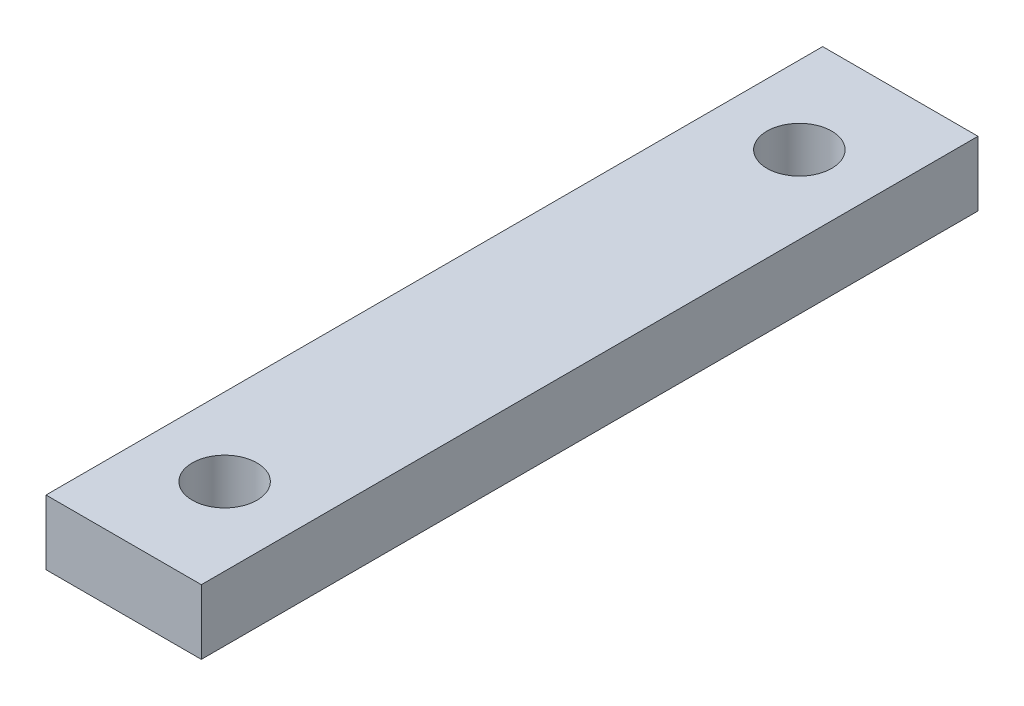
ISO-10303-21;
HEADER;
FILE_DESCRIPTION(('STEP AP214'),'2;1');
FILE_NAME('part.step','',(''),(''),'','','');
FILE_SCHEMA(('AUTOMOTIVE_DESIGN { 1 0 10303 214 1 1 1 1 }'));
ENDSEC;
DATA;
#1=APPLICATION_CONTEXT('core data for automotive mechanical design processes');
#2=APPLICATION_PROTOCOL_DEFINITION('international standard','automotive_design',2000,#1);
#3=PRODUCT_CONTEXT('',#1,'mechanical');
#4=PRODUCT('Part','Part','',(#3));
#5=PRODUCT_RELATED_PRODUCT_CATEGORY('part','',(#4));
#6=PRODUCT_DEFINITION_FORMATION('','',#4);
#7=PRODUCT_DEFINITION_CONTEXT('part definition',#1,'design');
#8=PRODUCT_DEFINITION('design','',#6,#7);
#9=PRODUCT_DEFINITION_SHAPE('','',#8);
#10=(LENGTH_UNIT() NAMED_UNIT(*) SI_UNIT(.MILLI.,.METRE.));
#11=(NAMED_UNIT(*) PLANE_ANGLE_UNIT() SI_UNIT($,.RADIAN.));
#12=(NAMED_UNIT(*) SI_UNIT($,.STERADIAN.) SOLID_ANGLE_UNIT());
#13=UNCERTAINTY_MEASURE_WITH_UNIT(LENGTH_MEASURE(1.E-05),#10,'distance_accuracy_value','');
#14=(GEOMETRIC_REPRESENTATION_CONTEXT(3) GLOBAL_UNCERTAINTY_ASSIGNED_CONTEXT((#13)) GLOBAL_UNIT_ASSIGNED_CONTEXT((#10,
#11,#12)) REPRESENTATION_CONTEXT('',''));
#15=CARTESIAN_POINT('',(0.,0.,0.));
#16=DIRECTION('',(0.,0.,1.));
#17=DIRECTION('',(1.,0.,0.));
#18=AXIS2_PLACEMENT_3D('',#15,#16,#17);
#19=CARTESIAN_POINT('',(30.,25.,150.));
#20=DIRECTION('',(-1.,0.,0.));
#21=DIRECTION('',(0.,0.,1.));
#22=AXIS2_PLACEMENT_3D('',#19,#20,#21);
#23=PLANE('',#22);
#24=DIRECTION('',(0.,0.,-1.));
#25=VECTOR('',#24,1.);
#26=CARTESIAN_POINT('',(30.,0.,150.));
#27=LINE('',#26,#25);
#28=CARTESIAN_POINT('',(30.,0.,150.));
#29=VERTEX_POINT('',#28);
#30=CARTESIAN_POINT('',(30.,0.,-150.));
#31=VERTEX_POINT('',#30);
#32=EDGE_CURVE('E80',#29,#31,#27,.T.);
#33=ORIENTED_EDGE('',*,*,#32,.T.);
#34=DIRECTION('',(0.,-1.,0.));
#35=VECTOR('',#34,1.);
#36=CARTESIAN_POINT('',(30.,25.,-150.));
#37=LINE('',#36,#35);
#38=CARTESIAN_POINT('',(30.,25.,-150.));
#39=VERTEX_POINT('',#38);
#40=EDGE_CURVE('E11',#39,#31,#37,.T.);
#41=ORIENTED_EDGE('',*,*,#40,.F.);
#42=DIRECTION('',(0.,0.,-1.));
#43=VECTOR('',#42,1.);
#44=CARTESIAN_POINT('',(30.,25.,150.));
#45=LINE('',#44,#43);
#46=CARTESIAN_POINT('',(30.,25.,150.));
#47=VERTEX_POINT('',#46);
#48=EDGE_CURVE('E68',#47,#39,#45,.T.);
#49=ORIENTED_EDGE('',*,*,#48,.F.);
#50=DIRECTION('',(0.,-1.,0.));
#51=VECTOR('',#50,1.);
#52=CARTESIAN_POINT('',(30.,25.,150.));
#53=LINE('',#52,#51);
#54=EDGE_CURVE('E76',#47,#29,#53,.T.);
#55=ORIENTED_EDGE('',*,*,#54,.T.);
#56=EDGE_LOOP('',(#33,#41,#49,#55));
#57=FACE_BOUND('',#56,.T.);
#58=ADVANCED_FACE('F17',(#57),#23,.F.);
#59=CARTESIAN_POINT('',(-30.,25.,-150.));
#60=DIRECTION('',(0.,0.,1.));
#61=DIRECTION('',(1.,0.,0.));
#62=AXIS2_PLACEMENT_3D('',#59,#60,#61);
#63=PLANE('',#62);
#64=DIRECTION('',(-1.,0.,0.));
#65=VECTOR('',#64,1.);
#66=CARTESIAN_POINT('',(-30.,0.,-150.));
#67=LINE('',#66,#65);
#68=CARTESIAN_POINT('',(-30.,0.,-150.));
#69=VERTEX_POINT('',#68);
#70=EDGE_CURVE('E72',#31,#69,#67,.T.);
#71=ORIENTED_EDGE('',*,*,#70,.T.);
#72=DIRECTION('',(0.,-1.,0.));
#73=VECTOR('',#72,1.);
#74=CARTESIAN_POINT('',(-30.,25.,-150.));
#75=LINE('',#74,#73);
#76=CARTESIAN_POINT('',(-30.,25.,-150.));
#77=VERTEX_POINT('',#76);
#78=EDGE_CURVE('E25',#77,#69,#75,.T.);
#79=ORIENTED_EDGE('',*,*,#78,.F.);
#80=DIRECTION('',(-1.,0.,0.));
#81=VECTOR('',#80,1.);
#82=CARTESIAN_POINT('',(-30.,25.,-150.));
#83=LINE('',#82,#81);
#84=EDGE_CURVE('E63',#39,#77,#83,.T.);
#85=ORIENTED_EDGE('',*,*,#84,.F.);
#86=ORIENTED_EDGE('',*,*,#40,.T.);
#87=EDGE_LOOP('',(#71,#79,#85,#86));
#88=FACE_BOUND('',#87,.T.);
#89=ADVANCED_FACE('F71',(#88),#63,.F.);
#90=CARTESIAN_POINT('',(-30.,25.,150.));
#91=DIRECTION('',(1.,0.,0.));
#92=DIRECTION('',(0.,0.,-1.));
#93=AXIS2_PLACEMENT_3D('',#90,#91,#92);
#94=PLANE('',#93);
#95=DIRECTION('',(0.,0.,1.));
#96=VECTOR('',#95,1.);
#97=CARTESIAN_POINT('',(-30.,0.,150.));
#98=LINE('',#97,#96);
#99=CARTESIAN_POINT('',(-30.,0.,150.));
#100=VERTEX_POINT('',#99);
#101=EDGE_CURVE('E50',#69,#100,#98,.T.);
#102=ORIENTED_EDGE('',*,*,#101,.T.);
#103=DIRECTION('',(0.,-1.,0.));
#104=VECTOR('',#103,1.);
#105=CARTESIAN_POINT('',(-30.,25.,150.));
#106=LINE('',#105,#104);
#107=CARTESIAN_POINT('',(-30.,25.,150.));
#108=VERTEX_POINT('',#107);
#109=EDGE_CURVE('E73',#108,#100,#106,.T.);
#110=ORIENTED_EDGE('',*,*,#109,.F.);
#111=DIRECTION('',(0.,0.,1.));
#112=VECTOR('',#111,1.);
#113=CARTESIAN_POINT('',(-30.,25.,150.));
#114=LINE('',#113,#112);
#115=EDGE_CURVE('E66',#77,#108,#114,.T.);
#116=ORIENTED_EDGE('',*,*,#115,.F.);
#117=ORIENTED_EDGE('',*,*,#78,.T.);
#118=EDGE_LOOP('',(#102,#110,#116,#117));
#119=FACE_BOUND('',#118,.T.);
#120=ADVANCED_FACE('F74',(#119),#94,.F.);
#121=CARTESIAN_POINT('',(-30.,25.,150.));
#122=DIRECTION('',(0.,0.,-1.));
#123=DIRECTION('',(-1.,0.,0.));
#124=AXIS2_PLACEMENT_3D('',#121,#122,#123);
#125=PLANE('',#124);
#126=DIRECTION('',(1.,0.,0.));
#127=VECTOR('',#126,1.);
#128=CARTESIAN_POINT('',(-30.,0.,150.));
#129=LINE('',#128,#127);
#130=EDGE_CURVE('E56',#100,#29,#129,.T.);
#131=ORIENTED_EDGE('',*,*,#130,.T.);
#132=ORIENTED_EDGE('',*,*,#54,.F.);
#133=DIRECTION('',(1.,0.,0.));
#134=VECTOR('',#133,1.);
#135=CARTESIAN_POINT('',(-30.,25.,150.));
#136=LINE('',#135,#134);
#137=EDGE_CURVE('E33',#108,#47,#136,.T.);
#138=ORIENTED_EDGE('',*,*,#137,.F.);
#139=ORIENTED_EDGE('',*,*,#109,.T.);
#140=EDGE_LOOP('',(#131,#132,#138,#139));
#141=FACE_BOUND('',#140,.T.);
#142=ADVANCED_FACE('F88',(#141),#125,.F.);
#143=CARTESIAN_POINT('',(0.,25.,0.));
#144=DIRECTION('',(0.,-1.,0.));
#145=DIRECTION('',(0.,0.,-1.));
#146=AXIS2_PLACEMENT_3D('',#143,#144,#145);
#147=PLANE('',#146);
#148=CARTESIAN_POINT('',(0.,25.,111.));
#149=DIRECTION('',(0.,1.,0.));
#150=DIRECTION('',(0.,0.,1.));
#151=AXIS2_PLACEMENT_3D('',#148,#149,#150);
#152=CIRCLE('',#151,12.5);
#153=CARTESIAN_POINT('',(0.,25.,123.5));
#154=VERTEX_POINT('',#153);
#155=EDGE_CURVE('E100',#154,#154,#152,.T.);
#156=ORIENTED_EDGE('',*,*,#155,.F.);
#157=EDGE_LOOP('',(#156));
#158=FACE_BOUND('',#157,.T.);
#159=CARTESIAN_POINT('',(0.,25.,-111.));
#160=DIRECTION('',(0.,1.,0.));
#161=DIRECTION('',(0.,0.,1.));
#162=AXIS2_PLACEMENT_3D('',#159,#160,#161);
#163=CIRCLE('',#162,12.5);
#164=CARTESIAN_POINT('',(0.,25.,-98.5));
#165=VERTEX_POINT('',#164);
#166=EDGE_CURVE('E94',#165,#165,#163,.T.);
#167=ORIENTED_EDGE('',*,*,#166,.F.);
#168=EDGE_LOOP('',(#167));
#169=FACE_BOUND('',#168,.T.);
#170=ORIENTED_EDGE('',*,*,#48,.T.);
#171=ORIENTED_EDGE('',*,*,#84,.T.);
#172=ORIENTED_EDGE('',*,*,#115,.T.);
#173=ORIENTED_EDGE('',*,*,#137,.T.);
#174=EDGE_LOOP('',(#170,#171,#172,#173));
#175=FACE_BOUND('',#174,.T.);
#176=ADVANCED_FACE('F64',(#158,#169,#175),#147,.F.);
#177=CARTESIAN_POINT('',(0.,0.,0.));
#178=DIRECTION('',(0.,-1.,0.));
#179=DIRECTION('',(0.,0.,-1.));
#180=AXIS2_PLACEMENT_3D('',#177,#178,#179);
#181=PLANE('',#180);
#182=CARTESIAN_POINT('',(0.,0.,111.));
#183=DIRECTION('',(0.,1.,0.));
#184=DIRECTION('',(0.,0.,1.));
#185=AXIS2_PLACEMENT_3D('',#182,#183,#184);
#186=CIRCLE('',#185,12.5);
#187=CARTESIAN_POINT('',(0.,0.,123.5));
#188=VERTEX_POINT('',#187);
#189=EDGE_CURVE('E97',#188,#188,#186,.T.);
#190=ORIENTED_EDGE('',*,*,#189,.T.);
#191=EDGE_LOOP('',(#190));
#192=FACE_BOUND('',#191,.T.);
#193=CARTESIAN_POINT('',(0.,0.,-111.));
#194=DIRECTION('',(0.,1.,0.));
#195=DIRECTION('',(0.,0.,1.));
#196=AXIS2_PLACEMENT_3D('',#193,#194,#195);
#197=CIRCLE('',#196,12.5);
#198=CARTESIAN_POINT('',(0.,0.,-98.5));
#199=VERTEX_POINT('',#198);
#200=EDGE_CURVE('E83',#199,#199,#197,.T.);
#201=ORIENTED_EDGE('',*,*,#200,.T.);
#202=EDGE_LOOP('',(#201));
#203=FACE_BOUND('',#202,.T.);
#204=ORIENTED_EDGE('',*,*,#32,.F.);
#205=ORIENTED_EDGE('',*,*,#130,.F.);
#206=ORIENTED_EDGE('',*,*,#101,.F.);
#207=ORIENTED_EDGE('',*,*,#70,.F.);
#208=EDGE_LOOP('',(#204,#205,#206,#207));
#209=FACE_BOUND('',#208,.T.);
#210=ADVANCED_FACE('F91',(#192,#203,#209),#181,.T.);
#211=CARTESIAN_POINT('',(0.,0.,-111.));
#212=DIRECTION('',(0.,1.,0.));
#213=DIRECTION('',(0.,0.,1.));
#214=AXIS2_PLACEMENT_3D('',#211,#212,#213);
#215=CYLINDRICAL_SURFACE('',#214,12.5);
#216=ORIENTED_EDGE('',*,*,#200,.F.);
#217=EDGE_LOOP('',(#216));
#218=FACE_BOUND('',#217,.T.);
#219=ORIENTED_EDGE('',*,*,#166,.T.);
#220=EDGE_LOOP('',(#219));
#221=FACE_BOUND('',#220,.T.);
#222=ADVANCED_FACE('F111',(#218,#221),#215,.F.);
#223=CARTESIAN_POINT('',(0.,0.,111.));
#224=DIRECTION('',(0.,1.,0.));
#225=DIRECTION('',(0.,0.,1.));
#226=AXIS2_PLACEMENT_3D('',#223,#224,#225);
#227=CYLINDRICAL_SURFACE('',#226,12.5);
#228=ORIENTED_EDGE('',*,*,#189,.F.);
#229=EDGE_LOOP('',(#228));
#230=FACE_BOUND('',#229,.T.);
#231=ORIENTED_EDGE('',*,*,#155,.T.);
#232=EDGE_LOOP('',(#231));
#233=FACE_BOUND('',#232,.T.);
#234=ADVANCED_FACE('F108',(#230,#233),#227,.F.);
#235=CLOSED_SHELL('',(#58,#89,#120,#142,#176,#210,#222,#234));
#236=MANIFOLD_SOLID_BREP('B1',#235);
#237=ADVANCED_BREP_SHAPE_REPRESENTATION('',(#18,#236),#14);
#238=SHAPE_DEFINITION_REPRESENTATION(#9,#237);
ENDSEC;
END-ISO-10303-21;
